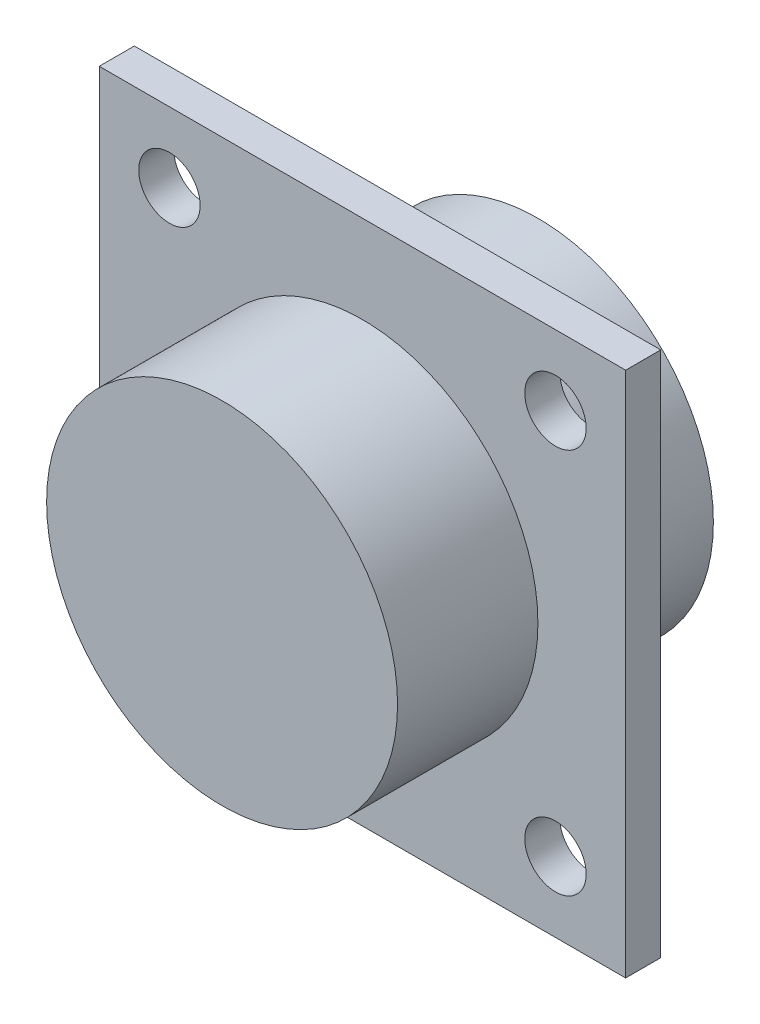
ISO-10303-21;
HEADER;
FILE_DESCRIPTION(('STEP AP214'),'2;1');
FILE_NAME('part.step','',(''),(''),'','','');
FILE_SCHEMA(('AUTOMOTIVE_DESIGN { 1 0 10303 214 1 1 1 1 }'));
ENDSEC;
DATA;
#1=APPLICATION_CONTEXT('core data for automotive mechanical design processes');
#2=APPLICATION_PROTOCOL_DEFINITION('international standard','automotive_design',2000,#1);
#3=PRODUCT_CONTEXT('',#1,'mechanical');
#4=PRODUCT('Part','Part','',(#3));
#5=PRODUCT_RELATED_PRODUCT_CATEGORY('part','',(#4));
#6=PRODUCT_DEFINITION_FORMATION('','',#4);
#7=PRODUCT_DEFINITION_CONTEXT('part definition',#1,'design');
#8=PRODUCT_DEFINITION('design','',#6,#7);
#9=PRODUCT_DEFINITION_SHAPE('','',#8);
#10=(LENGTH_UNIT() NAMED_UNIT(*) SI_UNIT(.MILLI.,.METRE.));
#11=(NAMED_UNIT(*) PLANE_ANGLE_UNIT() SI_UNIT($,.RADIAN.));
#12=(NAMED_UNIT(*) SI_UNIT($,.STERADIAN.) SOLID_ANGLE_UNIT());
#13=UNCERTAINTY_MEASURE_WITH_UNIT(LENGTH_MEASURE(1.E-05),#10,'distance_accuracy_value','');
#14=(GEOMETRIC_REPRESENTATION_CONTEXT(3) GLOBAL_UNCERTAINTY_ASSIGNED_CONTEXT((#13)) GLOBAL_UNIT_ASSIGNED_CONTEXT((#10,
#11,#12)) REPRESENTATION_CONTEXT('',''));
#15=CARTESIAN_POINT('',(0.,0.,0.));
#16=DIRECTION('',(0.,0.,1.));
#17=DIRECTION('',(1.,0.,0.));
#18=AXIS2_PLACEMENT_3D('',#15,#16,#17);
#19=CARTESIAN_POINT('',(-15.,15.,2.));
#20=DIRECTION('',(1.,0.,0.));
#21=DIRECTION('',(0.,1.,0.));
#22=AXIS2_PLACEMENT_3D('',#19,#20,#21);
#23=PLANE('',#22);
#24=DIRECTION('',(0.,-1.,0.));
#25=VECTOR('',#24,1.);
#26=CARTESIAN_POINT('',(-15.,15.,0.));
#27=LINE('',#26,#25);
#28=CARTESIAN_POINT('',(-15.,15.,0.));
#29=VERTEX_POINT('',#28);
#30=CARTESIAN_POINT('',(-15.,-15.,0.));
#31=VERTEX_POINT('',#30);
#32=EDGE_CURVE('E103',#29,#31,#27,.T.);
#33=ORIENTED_EDGE('',*,*,#32,.T.);
#34=DIRECTION('',(0.,0.,-1.));
#35=VECTOR('',#34,1.);
#36=CARTESIAN_POINT('',(-15.,-15.,2.));
#37=LINE('',#36,#35);
#38=CARTESIAN_POINT('',(-15.,-15.,2.));
#39=VERTEX_POINT('',#38);
#40=EDGE_CURVE('E44',#39,#31,#37,.T.);
#41=ORIENTED_EDGE('',*,*,#40,.F.);
#42=DIRECTION('',(0.,-1.,0.));
#43=VECTOR('',#42,1.);
#44=CARTESIAN_POINT('',(-15.,15.,2.));
#45=LINE('',#44,#43);
#46=CARTESIAN_POINT('',(-15.,15.,2.));
#47=VERTEX_POINT('',#46);
#48=EDGE_CURVE('E89',#47,#39,#45,.T.);
#49=ORIENTED_EDGE('',*,*,#48,.F.);
#50=DIRECTION('',(0.,0.,-1.));
#51=VECTOR('',#50,1.);
#52=CARTESIAN_POINT('',(-15.,15.,2.));
#53=LINE('',#52,#51);
#54=EDGE_CURVE('E99',#47,#29,#53,.T.);
#55=ORIENTED_EDGE('',*,*,#54,.T.);
#56=EDGE_LOOP('',(#33,#41,#49,#55));
#57=FACE_BOUND('',#56,.T.);
#58=ADVANCED_FACE('F35',(#57),#23,.F.);
#59=CARTESIAN_POINT('',(-15.,-15.,2.));
#60=DIRECTION('',(0.,1.,0.));
#61=DIRECTION('',(0.,0.,1.));
#62=AXIS2_PLACEMENT_3D('',#59,#60,#61);
#63=PLANE('',#62);
#64=DIRECTION('',(1.,0.,0.));
#65=VECTOR('',#64,1.);
#66=CARTESIAN_POINT('',(-15.,-15.,0.));
#67=LINE('',#66,#65);
#68=CARTESIAN_POINT('',(15.,-15.,0.));
#69=VERTEX_POINT('',#68);
#70=EDGE_CURVE('E94',#31,#69,#67,.T.);
#71=ORIENTED_EDGE('',*,*,#70,.T.);
#72=DIRECTION('',(0.,0.,-1.));
#73=VECTOR('',#72,1.);
#74=CARTESIAN_POINT('',(15.,-15.,2.));
#75=LINE('',#74,#73);
#76=CARTESIAN_POINT('',(15.,-15.,2.));
#77=VERTEX_POINT('',#76);
#78=EDGE_CURVE('E92',#77,#69,#75,.T.);
#79=ORIENTED_EDGE('',*,*,#78,.F.);
#80=DIRECTION('',(1.,0.,0.));
#81=VECTOR('',#80,1.);
#82=CARTESIAN_POINT('',(-15.,-15.,2.));
#83=LINE('',#82,#81);
#84=EDGE_CURVE('E84',#39,#77,#83,.T.);
#85=ORIENTED_EDGE('',*,*,#84,.F.);
#86=ORIENTED_EDGE('',*,*,#40,.T.);
#87=EDGE_LOOP('',(#71,#79,#85,#86));
#88=FACE_BOUND('',#87,.T.);
#89=ADVANCED_FACE('F93',(#88),#63,.F.);
#90=CARTESIAN_POINT('',(15.,15.,2.));
#91=DIRECTION('',(-1.,0.,0.));
#92=DIRECTION('',(0.,-1.,0.));
#93=AXIS2_PLACEMENT_3D('',#90,#91,#92);
#94=PLANE('',#93);
#95=DIRECTION('',(0.,1.,0.));
#96=VECTOR('',#95,1.);
#97=CARTESIAN_POINT('',(15.,15.,0.));
#98=LINE('',#97,#96);
#99=CARTESIAN_POINT('',(15.,15.,0.));
#100=VERTEX_POINT('',#99);
#101=EDGE_CURVE('E70',#69,#100,#98,.T.);
#102=ORIENTED_EDGE('',*,*,#101,.T.);
#103=DIRECTION('',(0.,0.,-1.));
#104=VECTOR('',#103,1.);
#105=CARTESIAN_POINT('',(15.,15.,2.));
#106=LINE('',#105,#104);
#107=CARTESIAN_POINT('',(15.,15.,2.));
#108=VERTEX_POINT('',#107);
#109=EDGE_CURVE('E95',#108,#100,#106,.T.);
#110=ORIENTED_EDGE('',*,*,#109,.F.);
#111=DIRECTION('',(0.,1.,0.));
#112=VECTOR('',#111,1.);
#113=CARTESIAN_POINT('',(15.,15.,2.));
#114=LINE('',#113,#112);
#115=EDGE_CURVE('E87',#77,#108,#114,.T.);
#116=ORIENTED_EDGE('',*,*,#115,.F.);
#117=ORIENTED_EDGE('',*,*,#78,.T.);
#118=EDGE_LOOP('',(#102,#110,#116,#117));
#119=FACE_BOUND('',#118,.T.);
#120=ADVANCED_FACE('F97',(#119),#94,.F.);
#121=CARTESIAN_POINT('',(-15.,15.,2.));
#122=DIRECTION('',(0.,-1.,0.));
#123=DIRECTION('',(0.,0.,-1.));
#124=AXIS2_PLACEMENT_3D('',#121,#122,#123);
#125=PLANE('',#124);
#126=DIRECTION('',(-1.,0.,0.));
#127=VECTOR('',#126,1.);
#128=CARTESIAN_POINT('',(-15.,15.,0.));
#129=LINE('',#128,#127);
#130=EDGE_CURVE('E76',#100,#29,#129,.T.);
#131=ORIENTED_EDGE('',*,*,#130,.T.);
#132=ORIENTED_EDGE('',*,*,#54,.F.);
#133=DIRECTION('',(-1.,0.,0.));
#134=VECTOR('',#133,1.);
#135=CARTESIAN_POINT('',(-15.,15.,2.));
#136=LINE('',#135,#134);
#137=EDGE_CURVE('E53',#108,#47,#136,.T.);
#138=ORIENTED_EDGE('',*,*,#137,.F.);
#139=ORIENTED_EDGE('',*,*,#109,.T.);
#140=EDGE_LOOP('',(#131,#132,#138,#139));
#141=FACE_BOUND('',#140,.T.);
#142=ADVANCED_FACE('F125',(#141),#125,.F.);
#143=CARTESIAN_POINT('',(0.,0.,2.));
#144=DIRECTION('',(0.,0.,1.));
#145=DIRECTION('',(1.,0.,0.));
#146=AXIS2_PLACEMENT_3D('',#143,#144,#145);
#147=PLANE('',#146);
#148=CARTESIAN_POINT('',(11.,-11.,2.));
#149=DIRECTION('',(0.,0.,1.));
#150=DIRECTION('',(1.,0.,0.));
#151=AXIS2_PLACEMENT_3D('',#148,#149,#150);
#152=CIRCLE('',#151,1.75);
#153=CARTESIAN_POINT('',(12.75,-11.,2.));
#154=VERTEX_POINT('',#153);
#155=EDGE_CURVE('E258',#154,#154,#152,.T.);
#156=ORIENTED_EDGE('',*,*,#155,.F.);
#157=EDGE_LOOP('',(#156));
#158=FACE_BOUND('',#157,.T.);
#159=CARTESIAN_POINT('',(-11.,-11.,2.));
#160=DIRECTION('',(0.,0.,1.));
#161=DIRECTION('',(1.,0.,0.));
#162=AXIS2_PLACEMENT_3D('',#159,#160,#161);
#163=CIRCLE('',#162,1.75);
#164=CARTESIAN_POINT('',(-9.25,-11.,2.));
#165=VERTEX_POINT('',#164);
#166=EDGE_CURVE('E252',#165,#165,#163,.T.);
#167=ORIENTED_EDGE('',*,*,#166,.F.);
#168=EDGE_LOOP('',(#167));
#169=FACE_BOUND('',#168,.T.);
#170=CARTESIAN_POINT('',(-11.,11.,2.));
#171=DIRECTION('',(0.,0.,1.));
#172=DIRECTION('',(1.,0.,0.));
#173=AXIS2_PLACEMENT_3D('',#170,#171,#172);
#174=CIRCLE('',#173,1.75);
#175=CARTESIAN_POINT('',(-9.25,11.,2.));
#176=VERTEX_POINT('',#175);
#177=EDGE_CURVE('E246',#176,#176,#174,.T.);
#178=ORIENTED_EDGE('',*,*,#177,.F.);
#179=EDGE_LOOP('',(#178));
#180=FACE_BOUND('',#179,.T.);
#181=CARTESIAN_POINT('',(11.,11.,2.));
#182=DIRECTION('',(0.,0.,1.));
#183=DIRECTION('',(1.,0.,0.));
#184=AXIS2_PLACEMENT_3D('',#181,#182,#183);
#185=CIRCLE('',#184,1.75);
#186=CARTESIAN_POINT('',(12.75,11.,2.));
#187=VERTEX_POINT('',#186);
#188=EDGE_CURVE('E239',#187,#187,#185,.T.);
#189=ORIENTED_EDGE('',*,*,#188,.F.);
#190=EDGE_LOOP('',(#189));
#191=FACE_BOUND('',#190,.T.);
#192=CARTESIAN_POINT('',(0.,0.,2.));
#193=DIRECTION('',(0.,0.,1.));
#194=DIRECTION('',(1.,0.,0.));
#195=AXIS2_PLACEMENT_3D('',#192,#193,#194);
#196=CIRCLE('',#195,10.);
#197=CARTESIAN_POINT('',(10.,0.,2.));
#198=VERTEX_POINT('',#197);
#199=EDGE_CURVE('E11',#198,#198,#196,.T.);
#200=ORIENTED_EDGE('',*,*,#199,.F.);
#201=EDGE_LOOP('',(#200));
#202=FACE_BOUND('',#201,.T.);
#203=ORIENTED_EDGE('',*,*,#48,.T.);
#204=ORIENTED_EDGE('',*,*,#84,.T.);
#205=ORIENTED_EDGE('',*,*,#115,.T.);
#206=ORIENTED_EDGE('',*,*,#137,.T.);
#207=EDGE_LOOP('',(#203,#204,#205,#206));
#208=FACE_BOUND('',#207,.T.);
#209=ADVANCED_FACE('F85',(#158,#169,#180,#191,#202,#208),#147,.T.);
#210=CARTESIAN_POINT('',(0.,0.,0.));
#211=DIRECTION('',(0.,0.,1.));
#212=DIRECTION('',(1.,0.,0.));
#213=AXIS2_PLACEMENT_3D('',#210,#211,#212);
#214=PLANE('',#213);
#215=CARTESIAN_POINT('',(11.,-11.,0.));
#216=DIRECTION('',(0.,0.,-1.));
#217=DIRECTION('',(1.,0.,0.));
#218=AXIS2_PLACEMENT_3D('',#215,#216,#217);
#219=CIRCLE('',#218,1.75);
#220=CARTESIAN_POINT('',(12.75,-11.,0.));
#221=VERTEX_POINT('',#220);
#222=EDGE_CURVE('E260',#221,#221,#219,.T.);
#223=ORIENTED_EDGE('',*,*,#222,.F.);
#224=EDGE_LOOP('',(#223));
#225=FACE_BOUND('',#224,.T.);
#226=CARTESIAN_POINT('',(-11.,-11.,0.));
#227=DIRECTION('',(0.,0.,-1.));
#228=DIRECTION('',(-1.,0.,0.));
#229=AXIS2_PLACEMENT_3D('',#226,#227,#228);
#230=CIRCLE('',#229,1.75);
#231=CARTESIAN_POINT('',(-12.75,-11.,0.));
#232=VERTEX_POINT('',#231);
#233=EDGE_CURVE('E255',#232,#232,#230,.T.);
#234=ORIENTED_EDGE('',*,*,#233,.F.);
#235=EDGE_LOOP('',(#234));
#236=FACE_BOUND('',#235,.T.);
#237=CARTESIAN_POINT('',(-11.,11.,0.));
#238=DIRECTION('',(0.,0.,-1.));
#239=DIRECTION('',(1.,0.,0.));
#240=AXIS2_PLACEMENT_3D('',#237,#238,#239);
#241=CIRCLE('',#240,1.75);
#242=CARTESIAN_POINT('',(-9.25,11.,0.));
#243=VERTEX_POINT('',#242);
#244=EDGE_CURVE('E249',#243,#243,#241,.T.);
#245=ORIENTED_EDGE('',*,*,#244,.F.);
#246=EDGE_LOOP('',(#245));
#247=FACE_BOUND('',#246,.T.);
#248=CARTESIAN_POINT('',(11.,11.,0.));
#249=DIRECTION('',(0.,0.,-1.));
#250=DIRECTION('',(-1.,0.,0.));
#251=AXIS2_PLACEMENT_3D('',#248,#249,#250);
#252=CIRCLE('',#251,1.75);
#253=CARTESIAN_POINT('',(9.25,11.,0.));
#254=VERTEX_POINT('',#253);
#255=EDGE_CURVE('E243',#254,#254,#252,.T.);
#256=ORIENTED_EDGE('',*,*,#255,.F.);
#257=EDGE_LOOP('',(#256));
#258=FACE_BOUND('',#257,.T.);
#259=CARTESIAN_POINT('',(0.,0.,0.));
#260=DIRECTION('',(0.,0.,1.));
#261=DIRECTION('',(1.,0.,0.));
#262=AXIS2_PLACEMENT_3D('',#259,#260,#261);
#263=CIRCLE('',#262,10.);
#264=CARTESIAN_POINT('',(10.,0.,0.));
#265=VERTEX_POINT('',#264);
#266=EDGE_CURVE('E38',#265,#265,#263,.T.);
#267=ORIENTED_EDGE('',*,*,#266,.T.);
#268=EDGE_LOOP('',(#267));
#269=FACE_BOUND('',#268,.T.);
#270=ORIENTED_EDGE('',*,*,#32,.F.);
#271=ORIENTED_EDGE('',*,*,#130,.F.);
#272=ORIENTED_EDGE('',*,*,#101,.F.);
#273=ORIENTED_EDGE('',*,*,#70,.F.);
#274=EDGE_LOOP('',(#270,#271,#272,#273));
#275=FACE_BOUND('',#274,.T.);
#276=ADVANCED_FACE('F113',(#225,#236,#247,#258,#269,#275),#214,.F.);
#277=CARTESIAN_POINT('',(0.,0.,-8.));
#278=DIRECTION('',(0.,0.,1.));
#279=DIRECTION('',(1.,0.,0.));
#280=AXIS2_PLACEMENT_3D('',#277,#278,#279);
#281=PLANE('',#280);
#282=CARTESIAN_POINT('',(0.,0.,-8.));
#283=DIRECTION('',(0.,0.,-1.));
#284=DIRECTION('',(-1.,0.,0.));
#285=AXIS2_PLACEMENT_3D('',#282,#283,#284);
#286=CIRCLE('',#285,8.5);
#287=CARTESIAN_POINT('',(-8.5,0.,-8.));
#288=VERTEX_POINT('',#287);
#289=EDGE_CURVE('E235',#288,#288,#286,.T.);
#290=ORIENTED_EDGE('',*,*,#289,.F.);
#291=EDGE_LOOP('',(#290));
#292=FACE_BOUND('',#291,.T.);
#293=CARTESIAN_POINT('',(0.,0.,-8.));
#294=DIRECTION('',(0.,0.,1.));
#295=DIRECTION('',(1.,0.,0.));
#296=AXIS2_PLACEMENT_3D('',#293,#294,#295);
#297=CIRCLE('',#296,10.);
#298=CARTESIAN_POINT('',(10.,0.,-8.));
#299=VERTEX_POINT('',#298);
#300=EDGE_CURVE('E229',#299,#299,#297,.T.);
#301=ORIENTED_EDGE('',*,*,#300,.F.);
#302=EDGE_LOOP('',(#301));
#303=FACE_BOUND('',#302,.T.);
#304=ADVANCED_FACE('F115',(#292,#303),#281,.F.);
#305=CARTESIAN_POINT('',(0.,0.,-8.));
#306=DIRECTION('',(0.,0.,1.));
#307=DIRECTION('',(1.,0.,0.));
#308=AXIS2_PLACEMENT_3D('',#305,#306,#307);
#309=CYLINDRICAL_SURFACE('',#308,10.);
#310=ORIENTED_EDGE('',*,*,#300,.T.);
#311=EDGE_LOOP('',(#310));
#312=FACE_BOUND('',#311,.T.);
#313=ORIENTED_EDGE('',*,*,#266,.F.);
#314=EDGE_LOOP('',(#313));
#315=FACE_BOUND('',#314,.T.);
#316=ADVANCED_FACE('F122',(#312,#315),#309,.T.);
#317=ORIENTED_EDGE('',*,*,#199,.T.);
#318=EDGE_LOOP('',(#317));
#319=FACE_BOUND('',#318,.T.);
#320=CARTESIAN_POINT('',(0.,0.,10.));
#321=DIRECTION('',(0.,0.,1.));
#322=DIRECTION('',(1.,0.,0.));
#323=AXIS2_PLACEMENT_3D('',#320,#321,#322);
#324=CIRCLE('',#323,10.);
#325=CARTESIAN_POINT('',(10.,0.,10.));
#326=VERTEX_POINT('',#325);
#327=EDGE_CURVE('E228',#326,#326,#324,.T.);
#328=ORIENTED_EDGE('',*,*,#327,.F.);
#329=EDGE_LOOP('',(#328));
#330=FACE_BOUND('',#329,.T.);
#331=ADVANCED_FACE('F215',(#319,#330),#309,.T.);
#332=CARTESIAN_POINT('',(0.,0.,10.));
#333=DIRECTION('',(0.,0.,1.));
#334=DIRECTION('',(1.,0.,0.));
#335=AXIS2_PLACEMENT_3D('',#332,#333,#334);
#336=PLANE('',#335);
#337=ORIENTED_EDGE('',*,*,#327,.T.);
#338=EDGE_LOOP('',(#337));
#339=FACE_BOUND('',#338,.T.);
#340=ADVANCED_FACE('F212',(#339),#336,.T.);
#341=CARTESIAN_POINT('',(0.,0.,0.));
#342=DIRECTION('',(0.,0.,-1.));
#343=DIRECTION('',(-1.,0.,0.));
#344=AXIS2_PLACEMENT_3D('',#341,#342,#343);
#345=CYLINDRICAL_SURFACE('',#344,8.5);
#346=CARTESIAN_POINT('',(0.,0.,0.));
#347=DIRECTION('',(0.,0.,-1.));
#348=DIRECTION('',(-1.,0.,0.));
#349=AXIS2_PLACEMENT_3D('',#346,#347,#348);
#350=CIRCLE('',#349,8.5);
#351=CARTESIAN_POINT('',(-8.5,0.,0.));
#352=VERTEX_POINT('',#351);
#353=EDGE_CURVE('E230',#352,#352,#350,.T.);
#354=ORIENTED_EDGE('',*,*,#353,.F.);
#355=EDGE_LOOP('',(#354));
#356=FACE_BOUND('',#355,.T.);
#357=ORIENTED_EDGE('',*,*,#289,.T.);
#358=EDGE_LOOP('',(#357));
#359=FACE_BOUND('',#358,.T.);
#360=ADVANCED_FACE('F208',(#356,#359),#345,.F.);
#361=CARTESIAN_POINT('',(0.,0.,0.));
#362=DIRECTION('',(0.,0.,-1.));
#363=DIRECTION('',(-1.,0.,0.));
#364=AXIS2_PLACEMENT_3D('',#361,#362,#363);
#365=PLANE('',#364);
#366=ORIENTED_EDGE('',*,*,#353,.T.);
#367=EDGE_LOOP('',(#366));
#368=FACE_BOUND('',#367,.T.);
#369=ADVANCED_FACE('F155',(#368),#365,.T.);
#370=CARTESIAN_POINT('',(11.,11.,8.));
#371=DIRECTION('',(0.,0.,-1.));
#372=DIRECTION('',(-1.,0.,0.));
#373=AXIS2_PLACEMENT_3D('',#370,#371,#372);
#374=CYLINDRICAL_SURFACE('',#373,1.75);
#375=ORIENTED_EDGE('',*,*,#188,.T.);
#376=EDGE_LOOP('',(#375));
#377=FACE_BOUND('',#376,.T.);
#378=ORIENTED_EDGE('',*,*,#255,.T.);
#379=EDGE_LOOP('',(#378));
#380=FACE_BOUND('',#379,.T.);
#381=ADVANCED_FACE('F165',(#377,#380),#374,.F.);
#382=CARTESIAN_POINT('',(-11.,11.,8.));
#383=DIRECTION('',(0.,0.,-1.));
#384=DIRECTION('',(-1.,0.,0.));
#385=AXIS2_PLACEMENT_3D('',#382,#383,#384);
#386=CYLINDRICAL_SURFACE('',#385,1.75);
#387=ORIENTED_EDGE('',*,*,#177,.T.);
#388=EDGE_LOOP('',(#387));
#389=FACE_BOUND('',#388,.T.);
#390=ORIENTED_EDGE('',*,*,#244,.T.);
#391=EDGE_LOOP('',(#390));
#392=FACE_BOUND('',#391,.T.);
#393=ADVANCED_FACE('F170',(#389,#392),#386,.F.);
#394=CARTESIAN_POINT('',(-11.,-11.,8.));
#395=DIRECTION('',(0.,0.,-1.));
#396=DIRECTION('',(-1.,0.,0.));
#397=AXIS2_PLACEMENT_3D('',#394,#395,#396);
#398=CYLINDRICAL_SURFACE('',#397,1.75);
#399=ORIENTED_EDGE('',*,*,#166,.T.);
#400=EDGE_LOOP('',(#399));
#401=FACE_BOUND('',#400,.T.);
#402=ORIENTED_EDGE('',*,*,#233,.T.);
#403=EDGE_LOOP('',(#402));
#404=FACE_BOUND('',#403,.T.);
#405=ADVANCED_FACE('F180',(#401,#404),#398,.F.);
#406=CARTESIAN_POINT('',(11.,-11.,8.));
#407=DIRECTION('',(0.,0.,-1.));
#408=DIRECTION('',(-1.,0.,0.));
#409=AXIS2_PLACEMENT_3D('',#406,#407,#408);
#410=CYLINDRICAL_SURFACE('',#409,1.75);
#411=ORIENTED_EDGE('',*,*,#155,.T.);
#412=EDGE_LOOP('',(#411));
#413=FACE_BOUND('',#412,.T.);
#414=ORIENTED_EDGE('',*,*,#222,.T.);
#415=EDGE_LOOP('',(#414));
#416=FACE_BOUND('',#415,.T.);
#417=ADVANCED_FACE('F190',(#413,#416),#410,.F.);
#418=CLOSED_SHELL('',(#58,#89,#120,#142,#209,#276,#304,#316,#331,#340,#360,#369,#381,#393,#405,#417));
#419=MANIFOLD_SOLID_BREP('B2',#418);
#420=ADVANCED_BREP_SHAPE_REPRESENTATION('',(#18,#419),#14);
#421=SHAPE_DEFINITION_REPRESENTATION(#9,#420);
ENDSEC;
END-ISO-10303-21;
